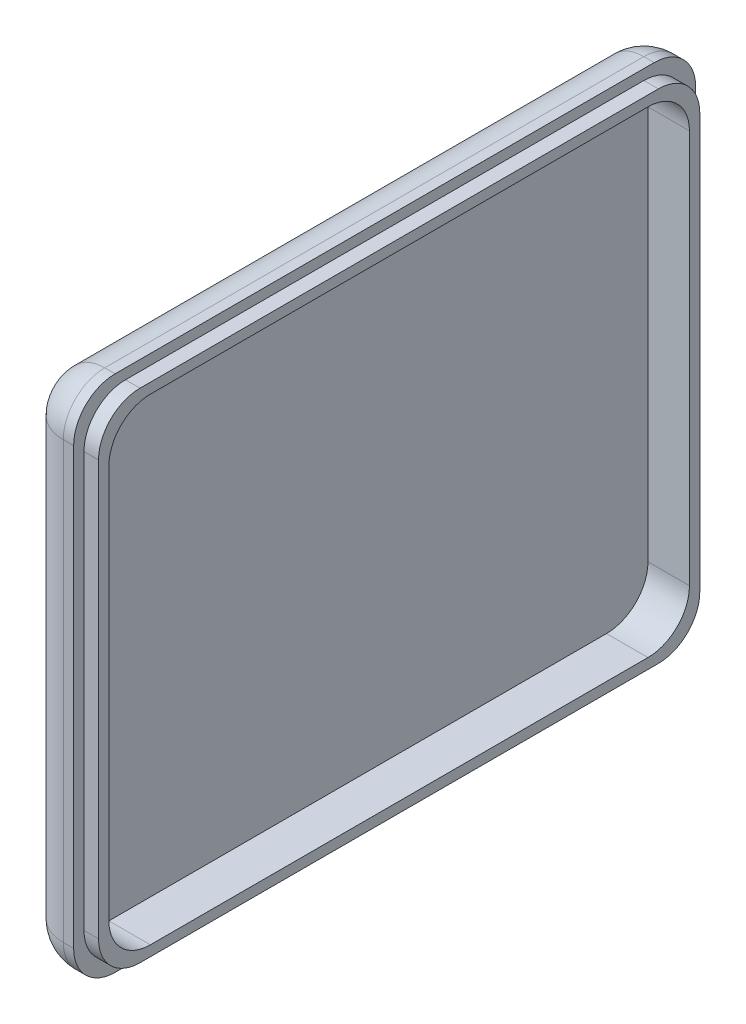
ISO-10303-21;
HEADER;
FILE_DESCRIPTION(('STEP AP214'),'2;1');
FILE_NAME('part.step','',(''),(''),'','','');
FILE_SCHEMA(('AUTOMOTIVE_DESIGN { 1 0 10303 214 1 1 1 1 }'));
ENDSEC;
DATA;
#1=APPLICATION_CONTEXT('core data for automotive mechanical design processes');
#2=APPLICATION_PROTOCOL_DEFINITION('international standard','automotive_design',2000,#1);
#3=PRODUCT_CONTEXT('',#1,'mechanical');
#4=PRODUCT('Part','Part','',(#3));
#5=PRODUCT_RELATED_PRODUCT_CATEGORY('part','',(#4));
#6=PRODUCT_DEFINITION_FORMATION('','',#4);
#7=PRODUCT_DEFINITION_CONTEXT('part definition',#1,'design');
#8=PRODUCT_DEFINITION('design','',#6,#7);
#9=PRODUCT_DEFINITION_SHAPE('','',#8);
#10=(LENGTH_UNIT() NAMED_UNIT(*) SI_UNIT(.MILLI.,.METRE.));
#11=(NAMED_UNIT(*) PLANE_ANGLE_UNIT() SI_UNIT($,.RADIAN.));
#12=(NAMED_UNIT(*) SI_UNIT($,.STERADIAN.) SOLID_ANGLE_UNIT());
#13=UNCERTAINTY_MEASURE_WITH_UNIT(LENGTH_MEASURE(1.E-05),#10,'distance_accuracy_value','');
#14=(GEOMETRIC_REPRESENTATION_CONTEXT(3) GLOBAL_UNCERTAINTY_ASSIGNED_CONTEXT((#13)) GLOBAL_UNIT_ASSIGNED_CONTEXT((#10,
#11,#12)) REPRESENTATION_CONTEXT('',''));
#15=CARTESIAN_POINT('',(0.,0.,0.));
#16=DIRECTION('',(0.,0.,1.));
#17=DIRECTION('',(1.,0.,0.));
#18=AXIS2_PLACEMENT_3D('',#15,#16,#17);
#19=CARTESIAN_POINT('',(6.35,63.5,-27.7706666666666));
#20=DIRECTION('',(0.,0.,-1.));
#21=DIRECTION('',(0.,1.,0.));
#22=AXIS2_PLACEMENT_3D('',#19,#20,#21);
#23=PLANE('',#22);
#24=DIRECTION('',(-1.,0.,0.));
#25=VECTOR('',#24,1.);
#26=CARTESIAN_POINT('',(6.35,58.42,-27.7706666666666));
#27=LINE('',#26,#25);
#28=CARTESIAN_POINT('',(6.35,58.42,-27.7706666666666));
#29=VERTEX_POINT('',#28);
#30=CARTESIAN_POINT('',(5.08,58.42,-27.7706666666666));
#31=VERTEX_POINT('',#30);
#32=EDGE_CURVE('E423',#29,#31,#27,.T.);
#33=ORIENTED_EDGE('',*,*,#32,.T.);
#34=DIRECTION('',(0.,-1.,0.));
#35=VECTOR('',#34,1.);
#36=CARTESIAN_POINT('',(5.08,63.5,-27.7706666666666));
#37=LINE('',#36,#35);
#38=CARTESIAN_POINT('',(5.08,5.08,-27.7706666666667));
#39=VERTEX_POINT('',#38);
#40=EDGE_CURVE('E11',#31,#39,#37,.T.);
#41=ORIENTED_EDGE('',*,*,#40,.T.);
#42=DIRECTION('',(-1.,0.,0.));
#43=VECTOR('',#42,1.);
#44=CARTESIAN_POINT('',(6.35,5.08,-27.7706666666667));
#45=LINE('',#44,#43);
#46=CARTESIAN_POINT('',(6.35,5.08,-27.7706666666667));
#47=VERTEX_POINT('',#46);
#48=EDGE_CURVE('E371',#39,#47,#45,.F.);
#49=ORIENTED_EDGE('',*,*,#48,.T.);
#50=DIRECTION('',(0.,-1.,0.));
#51=VECTOR('',#50,1.);
#52=CARTESIAN_POINT('',(6.35,63.5,-27.7706666666666));
#53=LINE('',#52,#51);
#54=EDGE_CURVE('E280',#29,#47,#53,.T.);
#55=ORIENTED_EDGE('',*,*,#54,.F.);
#56=EDGE_LOOP('',(#33,#41,#49,#55));
#57=FACE_BOUND('',#56,.T.);
#58=ADVANCED_FACE('F41',(#57),#23,.F.);
#59=CARTESIAN_POINT('',(6.35,0.,-27.7706666666667));
#60=DIRECTION('',(0.,1.,0.));
#61=DIRECTION('',(0.,0.,1.));
#62=AXIS2_PLACEMENT_3D('',#59,#60,#61);
#63=PLANE('',#62);
#64=DIRECTION('',(-1.,0.,0.));
#65=VECTOR('',#64,1.);
#66=CARTESIAN_POINT('',(6.35,0.,-32.8506666666667));
#67=LINE('',#66,#65);
#68=CARTESIAN_POINT('',(6.35,0.,-32.8506666666667));
#69=VERTEX_POINT('',#68);
#70=CARTESIAN_POINT('',(5.08,0.,-32.8506666666667));
#71=VERTEX_POINT('',#70);
#72=EDGE_CURVE('E367',#69,#71,#67,.T.);
#73=ORIENTED_EDGE('',*,*,#72,.T.);
#74=DIRECTION('',(0.,0.,-1.));
#75=VECTOR('',#74,1.);
#76=CARTESIAN_POINT('',(5.08,0.,-27.7706666666667));
#77=LINE('',#76,#75);
#78=CARTESIAN_POINT('',(5.08,0.,-98.8906666666667));
#79=VERTEX_POINT('',#78);
#80=EDGE_CURVE('E51',#71,#79,#77,.T.);
#81=ORIENTED_EDGE('',*,*,#80,.T.);
#82=DIRECTION('',(-1.,0.,0.));
#83=VECTOR('',#82,1.);
#84=CARTESIAN_POINT('',(6.35,0.,-98.8906666666667));
#85=LINE('',#84,#83);
#86=CARTESIAN_POINT('',(6.35,0.,-98.8906666666666));
#87=VERTEX_POINT('',#86);
#88=EDGE_CURVE('E405',#79,#87,#85,.F.);
#89=ORIENTED_EDGE('',*,*,#88,.T.);
#90=DIRECTION('',(0.,0.,-1.));
#91=VECTOR('',#90,1.);
#92=CARTESIAN_POINT('',(6.35,0.,-27.7706666666667));
#93=LINE('',#92,#91);
#94=EDGE_CURVE('E299',#69,#87,#93,.T.);
#95=ORIENTED_EDGE('',*,*,#94,.F.);
#96=EDGE_LOOP('',(#73,#81,#89,#95));
#97=FACE_BOUND('',#96,.T.);
#98=ADVANCED_FACE('F556',(#97),#63,.F.);
#99=CARTESIAN_POINT('',(6.35,63.5,-103.970666666667));
#100=DIRECTION('',(0.,0.,1.));
#101=DIRECTION('',(1.,0.,0.));
#102=AXIS2_PLACEMENT_3D('',#99,#100,#101);
#103=PLANE('',#102);
#104=DIRECTION('',(-1.,0.,0.));
#105=VECTOR('',#104,1.);
#106=CARTESIAN_POINT('',(6.35,5.08,-103.970666666667));
#107=LINE('',#106,#105);
#108=CARTESIAN_POINT('',(6.35,5.08,-103.970666666667));
#109=VERTEX_POINT('',#108);
#110=CARTESIAN_POINT('',(5.08,5.08,-103.970666666667));
#111=VERTEX_POINT('',#110);
#112=EDGE_CURVE('E381',#109,#111,#107,.T.);
#113=ORIENTED_EDGE('',*,*,#112,.T.);
#114=DIRECTION('',(0.,1.,0.));
#115=VECTOR('',#114,1.);
#116=CARTESIAN_POINT('',(5.08,63.5,-103.970666666667));
#117=LINE('',#116,#115);
#118=CARTESIAN_POINT('',(5.08,58.42,-103.970666666667));
#119=VERTEX_POINT('',#118);
#120=EDGE_CURVE('E473',#111,#119,#117,.T.);
#121=ORIENTED_EDGE('',*,*,#120,.T.);
#122=DIRECTION('',(-1.,0.,0.));
#123=VECTOR('',#122,1.);
#124=CARTESIAN_POINT('',(6.35,58.42,-103.970666666667));
#125=LINE('',#124,#123);
#126=CARTESIAN_POINT('',(6.35,58.42,-103.970666666667));
#127=VERTEX_POINT('',#126);
#128=EDGE_CURVE('E385',#119,#127,#125,.F.);
#129=ORIENTED_EDGE('',*,*,#128,.T.);
#130=DIRECTION('',(0.,1.,0.));
#131=VECTOR('',#130,1.);
#132=CARTESIAN_POINT('',(6.35,63.5,-103.970666666667));
#133=LINE('',#132,#131);
#134=EDGE_CURVE('E303',#109,#127,#133,.T.);
#135=ORIENTED_EDGE('',*,*,#134,.F.);
#136=EDGE_LOOP('',(#113,#121,#129,#135));
#137=FACE_BOUND('',#136,.T.);
#138=ADVANCED_FACE('F519',(#137),#103,.F.);
#139=CARTESIAN_POINT('',(6.35,63.5,-27.7706666666666));
#140=DIRECTION('',(0.,-1.,0.));
#141=DIRECTION('',(0.,0.,-1.));
#142=AXIS2_PLACEMENT_3D('',#139,#140,#141);
#143=PLANE('',#142);
#144=DIRECTION('',(-1.,0.,0.));
#145=VECTOR('',#144,1.);
#146=CARTESIAN_POINT('',(6.35,63.5,-98.8906666666667));
#147=LINE('',#146,#145);
#148=CARTESIAN_POINT('',(6.35,63.5,-98.8906666666667));
#149=VERTEX_POINT('',#148);
#150=CARTESIAN_POINT('',(5.08,63.5,-98.8906666666667));
#151=VERTEX_POINT('',#150);
#152=EDGE_CURVE('E377',#149,#151,#147,.T.);
#153=ORIENTED_EDGE('',*,*,#152,.T.);
#154=DIRECTION('',(0.,0.,1.));
#155=VECTOR('',#154,1.);
#156=CARTESIAN_POINT('',(5.08,63.5,-27.7706666666666));
#157=LINE('',#156,#155);
#158=CARTESIAN_POINT('',(5.08,63.5,-32.8506666666666));
#159=VERTEX_POINT('',#158);
#160=EDGE_CURVE('E459',#151,#159,#157,.T.);
#161=ORIENTED_EDGE('',*,*,#160,.T.);
#162=DIRECTION('',(-1.,0.,0.));
#163=VECTOR('',#162,1.);
#164=CARTESIAN_POINT('',(6.35,63.5,-32.8506666666666));
#165=LINE('',#164,#163);
#166=CARTESIAN_POINT('',(6.35,63.5,-32.8506666666666));
#167=VERTEX_POINT('',#166);
#168=EDGE_CURVE('E427',#159,#167,#165,.F.);
#169=ORIENTED_EDGE('',*,*,#168,.T.);
#170=DIRECTION('',(0.,0.,1.));
#171=VECTOR('',#170,1.);
#172=CARTESIAN_POINT('',(6.35,63.5,-27.7706666666666));
#173=LINE('',#172,#171);
#174=EDGE_CURVE('E307',#149,#167,#173,.T.);
#175=ORIENTED_EDGE('',*,*,#174,.F.);
#176=EDGE_LOOP('',(#153,#161,#169,#175));
#177=FACE_BOUND('',#176,.T.);
#178=ADVANCED_FACE('F531',(#177),#143,.F.);
#179=CARTESIAN_POINT('',(6.35,0.,0.));
#180=DIRECTION('',(1.,0.,0.));
#181=DIRECTION('',(0.,0.,-1.));
#182=AXIS2_PLACEMENT_3D('',#179,#180,#181);
#183=PLANE('',#182);
#184=DIRECTION('',(0.,-1.,0.));
#185=VECTOR('',#184,1.);
#186=CARTESIAN_POINT('',(6.35,62.23,-29.0406666666666));
#187=LINE('',#186,#185);
#188=CARTESIAN_POINT('',(6.35,57.15,-29.0406666666666));
#189=VERTEX_POINT('',#188);
#190=CARTESIAN_POINT('',(6.35,6.35,-29.0406666666667));
#191=VERTEX_POINT('',#190);
#192=EDGE_CURVE('E281',#189,#191,#187,.T.);
#193=ORIENTED_EDGE('',*,*,#192,.F.);
#194=CARTESIAN_POINT('',(6.35,57.15,-34.1206666666666));
#195=DIRECTION('',(1.,0.,0.));
#196=DIRECTION('',(0.,0.,-1.));
#197=AXIS2_PLACEMENT_3D('',#194,#195,#196);
#198=CIRCLE('',#197,5.08);
#199=CARTESIAN_POINT('',(6.35,62.23,-34.1206666666666));
#200=VERTEX_POINT('',#199);
#201=EDGE_CURVE('E440',#189,#200,#198,.F.);
#202=ORIENTED_EDGE('',*,*,#201,.T.);
#203=DIRECTION('',(0.,0.,1.));
#204=VECTOR('',#203,1.);
#205=CARTESIAN_POINT('',(6.35,62.23,-29.0406666666666));
#206=LINE('',#205,#204);
#207=CARTESIAN_POINT('',(6.35,62.23,-97.6206666666666));
#208=VERTEX_POINT('',#207);
#209=EDGE_CURVE('E268',#208,#200,#206,.T.);
#210=ORIENTED_EDGE('',*,*,#209,.F.);
#211=CARTESIAN_POINT('',(6.35,57.15,-97.6206666666667));
#212=DIRECTION('',(1.,0.,0.));
#213=DIRECTION('',(0.,0.,-1.));
#214=AXIS2_PLACEMENT_3D('',#211,#212,#213);
#215=CIRCLE('',#214,5.08);
#216=CARTESIAN_POINT('',(6.35,57.15,-102.700666666667));
#217=VERTEX_POINT('',#216);
#218=EDGE_CURVE('E411',#208,#217,#215,.F.);
#219=ORIENTED_EDGE('',*,*,#218,.T.);
#220=DIRECTION('',(0.,1.,0.));
#221=VECTOR('',#220,1.);
#222=CARTESIAN_POINT('',(6.35,62.23,-102.700666666667));
#223=LINE('',#222,#221);
#224=CARTESIAN_POINT('',(6.35,6.35,-102.700666666667));
#225=VERTEX_POINT('',#224);
#226=EDGE_CURVE('E289',#225,#217,#223,.T.);
#227=ORIENTED_EDGE('',*,*,#226,.F.);
#228=CARTESIAN_POINT('',(6.35,6.35,-97.6206666666667));
#229=DIRECTION('',(1.,0.,0.));
#230=DIRECTION('',(0.,0.,-1.));
#231=AXIS2_PLACEMENT_3D('',#228,#229,#230);
#232=CIRCLE('',#231,5.08);
#233=CARTESIAN_POINT('',(6.35,1.27,-97.6206666666667));
#234=VERTEX_POINT('',#233);
#235=EDGE_CURVE('E414',#225,#234,#232,.F.);
#236=ORIENTED_EDGE('',*,*,#235,.T.);
#237=DIRECTION('',(0.,0.,-1.));
#238=VECTOR('',#237,1.);
#239=CARTESIAN_POINT('',(6.35,1.27,-29.0406666666667));
#240=LINE('',#239,#238);
#241=CARTESIAN_POINT('',(6.35,1.27,-34.1206666666667));
#242=VERTEX_POINT('',#241);
#243=EDGE_CURVE('E284',#242,#234,#240,.T.);
#244=ORIENTED_EDGE('',*,*,#243,.F.);
#245=CARTESIAN_POINT('',(6.35,6.35,-34.1206666666667));
#246=DIRECTION('',(1.,0.,0.));
#247=DIRECTION('',(0.,0.,-1.));
#248=AXIS2_PLACEMENT_3D('',#245,#246,#247);
#249=CIRCLE('',#248,5.08);
#250=EDGE_CURVE('E363',#242,#191,#249,.F.);
#251=ORIENTED_EDGE('',*,*,#250,.T.);
#252=EDGE_LOOP('',(#193,#202,#210,#219,#227,#236,#244,#251));
#253=FACE_BOUND('',#252,.T.);
#254=ORIENTED_EDGE('',*,*,#174,.T.);
#255=CARTESIAN_POINT('',(6.35,58.42,-32.8506666666666));
#256=DIRECTION('',(1.,0.,0.));
#257=DIRECTION('',(0.,0.,-1.));
#258=AXIS2_PLACEMENT_3D('',#255,#256,#257);
#259=CIRCLE('',#258,5.08);
#260=EDGE_CURVE('E443',#167,#29,#259,.T.);
#261=ORIENTED_EDGE('',*,*,#260,.T.);
#262=ORIENTED_EDGE('',*,*,#54,.T.);
#263=CARTESIAN_POINT('',(6.35,5.08,-32.8506666666667));
#264=DIRECTION('',(1.,0.,0.));
#265=DIRECTION('',(0.,0.,-1.));
#266=AXIS2_PLACEMENT_3D('',#263,#264,#265);
#267=CIRCLE('',#266,5.08);
#268=EDGE_CURVE('E374',#47,#69,#267,.T.);
#269=ORIENTED_EDGE('',*,*,#268,.T.);
#270=ORIENTED_EDGE('',*,*,#94,.T.);
#271=CARTESIAN_POINT('',(6.35,5.08,-98.8906666666667));
#272=DIRECTION('',(1.,0.,0.));
#273=DIRECTION('',(0.,0.,-1.));
#274=AXIS2_PLACEMENT_3D('',#271,#272,#273);
#275=CIRCLE('',#274,5.08);
#276=EDGE_CURVE('E417',#87,#109,#275,.T.);
#277=ORIENTED_EDGE('',*,*,#276,.T.);
#278=ORIENTED_EDGE('',*,*,#134,.T.);
#279=CARTESIAN_POINT('',(6.35,58.42,-98.8906666666667));
#280=DIRECTION('',(1.,0.,0.));
#281=DIRECTION('',(0.,0.,-1.));
#282=AXIS2_PLACEMENT_3D('',#279,#280,#281);
#283=CIRCLE('',#282,5.08);
#284=EDGE_CURVE('E420',#127,#149,#283,.T.);
#285=ORIENTED_EDGE('',*,*,#284,.T.);
#286=EDGE_LOOP('',(#254,#261,#262,#269,#270,#277,#278,#285));
#287=FACE_BOUND('',#286,.T.);
#288=ADVANCED_FACE('F523',(#253,#287),#183,.T.);
#289=CARTESIAN_POINT('',(0.,0.,0.));
#290=DIRECTION('',(1.,0.,0.));
#291=DIRECTION('',(0.,0.,-1.));
#292=AXIS2_PLACEMENT_3D('',#289,#290,#291);
#293=PLANE('',#292);
#294=DIRECTION('',(0.,-1.,0.));
#295=VECTOR('',#294,1.);
#296=CARTESIAN_POINT('',(0.,0.,-32.8506666666667));
#297=LINE('',#296,#295);
#298=CARTESIAN_POINT('',(0.,5.08,-32.8506666666667));
#299=VERTEX_POINT('',#298);
#300=CARTESIAN_POINT('',(0.,58.42,-32.8506666666666));
#301=VERTEX_POINT('',#300);
#302=EDGE_CURVE('E462',#299,#301,#297,.F.);
#303=ORIENTED_EDGE('',*,*,#302,.T.);
#304=DIRECTION('',(0.,0.,1.));
#305=VECTOR('',#304,1.);
#306=CARTESIAN_POINT('',(0.,58.42,0.));
#307=LINE('',#306,#305);
#308=CARTESIAN_POINT('',(0.,58.42,-98.8906666666667));
#309=VERTEX_POINT('',#308);
#310=EDGE_CURVE('E470',#301,#309,#307,.F.);
#311=ORIENTED_EDGE('',*,*,#310,.T.);
#312=DIRECTION('',(0.,1.,0.));
#313=VECTOR('',#312,1.);
#314=CARTESIAN_POINT('',(0.,0.,-98.8906666666667));
#315=LINE('',#314,#313);
#316=CARTESIAN_POINT('',(0.,5.08,-98.8906666666667));
#317=VERTEX_POINT('',#316);
#318=EDGE_CURVE('E67',#309,#317,#315,.F.);
#319=ORIENTED_EDGE('',*,*,#318,.T.);
#320=DIRECTION('',(0.,0.,-1.));
#321=VECTOR('',#320,1.);
#322=CARTESIAN_POINT('',(0.,5.08,0.));
#323=LINE('',#322,#321);
#324=EDGE_CURVE('E465',#317,#299,#323,.F.);
#325=ORIENTED_EDGE('',*,*,#324,.T.);
#326=EDGE_LOOP('',(#303,#311,#319,#325));
#327=FACE_BOUND('',#326,.T.);
#328=ADVANCED_FACE('F753',(#327),#293,.F.);
#329=CARTESIAN_POINT('',(8.128,62.23,-29.0406666666666));
#330=DIRECTION('',(0.,0.,-1.));
#331=DIRECTION('',(0.,1.,0.));
#332=AXIS2_PLACEMENT_3D('',#329,#330,#331);
#333=PLANE('',#332);
#334=DIRECTION('',(0.,-1.,0.));
#335=VECTOR('',#334,1.);
#336=CARTESIAN_POINT('',(8.128,62.23,-29.0406666666666));
#337=LINE('',#336,#335);
#338=CARTESIAN_POINT('',(8.128,57.15,-29.0406666666666));
#339=VERTEX_POINT('',#338);
#340=CARTESIAN_POINT('',(8.128,6.35,-29.0406666666667));
#341=VERTEX_POINT('',#340);
#342=EDGE_CURVE('E264',#339,#341,#337,.T.);
#343=ORIENTED_EDGE('',*,*,#342,.F.);
#344=DIRECTION('',(-1.,0.,0.));
#345=VECTOR('',#344,1.);
#346=CARTESIAN_POINT('',(8.128,57.15,-29.0406666666666));
#347=LINE('',#346,#345);
#348=EDGE_CURVE('E430',#339,#189,#347,.T.);
#349=ORIENTED_EDGE('',*,*,#348,.T.);
#350=ORIENTED_EDGE('',*,*,#192,.T.);
#351=DIRECTION('',(-1.,0.,0.));
#352=VECTOR('',#351,1.);
#353=CARTESIAN_POINT('',(8.128,6.35,-29.0406666666667));
#354=LINE('',#353,#352);
#355=EDGE_CURVE('E356',#191,#341,#354,.F.);
#356=ORIENTED_EDGE('',*,*,#355,.T.);
#357=EDGE_LOOP('',(#343,#349,#350,#356));
#358=FACE_BOUND('',#357,.T.);
#359=ADVANCED_FACE('F746',(#358),#333,.F.);
#360=CARTESIAN_POINT('',(8.128,1.27,-29.0406666666667));
#361=DIRECTION('',(0.,1.,0.));
#362=DIRECTION('',(0.,0.,1.));
#363=AXIS2_PLACEMENT_3D('',#360,#361,#362);
#364=PLANE('',#363);
#365=ORIENTED_EDGE('',*,*,#243,.T.);
#366=DIRECTION('',(-1.,0.,0.));
#367=VECTOR('',#366,1.);
#368=CARTESIAN_POINT('',(8.128,1.27,-97.6206666666667));
#369=LINE('',#368,#367);
#370=CARTESIAN_POINT('',(8.128,1.27,-97.6206666666667));
#371=VERTEX_POINT('',#370);
#372=EDGE_CURVE('E408',#234,#371,#369,.F.);
#373=ORIENTED_EDGE('',*,*,#372,.T.);
#374=DIRECTION('',(0.,0.,-1.));
#375=VECTOR('',#374,1.);
#376=CARTESIAN_POINT('',(8.128,1.27,-29.0406666666667));
#377=LINE('',#376,#375);
#378=CARTESIAN_POINT('',(8.128,1.27,-34.1206666666667));
#379=VERTEX_POINT('',#378);
#380=EDGE_CURVE('E267',#379,#371,#377,.T.);
#381=ORIENTED_EDGE('',*,*,#380,.F.);
#382=DIRECTION('',(-1.,0.,0.));
#383=VECTOR('',#382,1.);
#384=CARTESIAN_POINT('',(8.128,1.27,-34.1206666666667));
#385=LINE('',#384,#383);
#386=EDGE_CURVE('E352',#379,#242,#385,.T.);
#387=ORIENTED_EDGE('',*,*,#386,.T.);
#388=EDGE_LOOP('',(#365,#373,#381,#387));
#389=FACE_BOUND('',#388,.T.);
#390=ADVANCED_FACE('F739',(#389),#364,.F.);
#391=CARTESIAN_POINT('',(8.128,62.23,-102.700666666667));
#392=DIRECTION('',(0.,0.,1.));
#393=DIRECTION('',(1.,0.,0.));
#394=AXIS2_PLACEMENT_3D('',#391,#392,#393);
#395=PLANE('',#394);
#396=ORIENTED_EDGE('',*,*,#226,.T.);
#397=DIRECTION('',(-1.,0.,0.));
#398=VECTOR('',#397,1.);
#399=CARTESIAN_POINT('',(8.128,57.15,-102.700666666667));
#400=LINE('',#399,#398);
#401=CARTESIAN_POINT('',(8.128,57.15,-102.700666666667));
#402=VERTEX_POINT('',#401);
#403=EDGE_CURVE('E396',#217,#402,#400,.F.);
#404=ORIENTED_EDGE('',*,*,#403,.T.);
#405=DIRECTION('',(0.,1.,0.));
#406=VECTOR('',#405,1.);
#407=CARTESIAN_POINT('',(8.128,62.23,-102.700666666667));
#408=LINE('',#407,#406);
#409=CARTESIAN_POINT('',(8.128,6.35,-102.700666666667));
#410=VERTEX_POINT('',#409);
#411=EDGE_CURVE('E272',#410,#402,#408,.T.);
#412=ORIENTED_EDGE('',*,*,#411,.F.);
#413=DIRECTION('',(-1.,0.,0.));
#414=VECTOR('',#413,1.);
#415=CARTESIAN_POINT('',(8.128,6.35,-102.700666666667));
#416=LINE('',#415,#414);
#417=EDGE_CURVE('E392',#410,#225,#416,.T.);
#418=ORIENTED_EDGE('',*,*,#417,.T.);
#419=EDGE_LOOP('',(#396,#404,#412,#418));
#420=FACE_BOUND('',#419,.T.);
#421=ADVANCED_FACE('F731',(#420),#395,.F.);
#422=CARTESIAN_POINT('',(8.128,62.23,-29.0406666666666));
#423=DIRECTION('',(0.,-1.,0.));
#424=DIRECTION('',(0.,0.,-1.));
#425=AXIS2_PLACEMENT_3D('',#422,#423,#424);
#426=PLANE('',#425);
#427=ORIENTED_EDGE('',*,*,#209,.T.);
#428=DIRECTION('',(-1.,0.,0.));
#429=VECTOR('',#428,1.);
#430=CARTESIAN_POINT('',(8.128,62.23,-34.1206666666666));
#431=LINE('',#430,#429);
#432=CARTESIAN_POINT('',(8.128,62.23,-34.1206666666666));
#433=VERTEX_POINT('',#432);
#434=EDGE_CURVE('E434',#200,#433,#431,.F.);
#435=ORIENTED_EDGE('',*,*,#434,.T.);
#436=DIRECTION('',(0.,0.,1.));
#437=VECTOR('',#436,1.);
#438=CARTESIAN_POINT('',(8.128,62.23,-29.0406666666666));
#439=LINE('',#438,#437);
#440=CARTESIAN_POINT('',(8.128,62.23,-97.6206666666666));
#441=VERTEX_POINT('',#440);
#442=EDGE_CURVE('E276',#441,#433,#439,.T.);
#443=ORIENTED_EDGE('',*,*,#442,.F.);
#444=DIRECTION('',(-1.,0.,0.));
#445=VECTOR('',#444,1.);
#446=CARTESIAN_POINT('',(8.128,62.23,-97.6206666666667));
#447=LINE('',#446,#445);
#448=EDGE_CURVE('E388',#441,#208,#447,.T.);
#449=ORIENTED_EDGE('',*,*,#448,.T.);
#450=EDGE_LOOP('',(#427,#435,#443,#449));
#451=FACE_BOUND('',#450,.T.);
#452=ADVANCED_FACE('F724',(#451),#426,.F.);
#453=CARTESIAN_POINT('',(8.128,0.,0.));
#454=DIRECTION('',(1.,0.,0.));
#455=DIRECTION('',(0.,0.,-1.));
#456=AXIS2_PLACEMENT_3D('',#453,#454,#455);
#457=PLANE('',#456);
#458=DIRECTION('',(0.,-1.,0.));
#459=VECTOR('',#458,1.);
#460=CARTESIAN_POINT('',(8.128,60.96,-30.3106666666666));
#461=LINE('',#460,#459);
#462=CARTESIAN_POINT('',(8.128,55.88,-30.3106666666666));
#463=VERTEX_POINT('',#462);
#464=CARTESIAN_POINT('',(8.128,7.62,-30.3106666666667));
#465=VERTEX_POINT('',#464);
#466=EDGE_CURVE('E250',#463,#465,#461,.T.);
#467=ORIENTED_EDGE('',*,*,#466,.F.);
#468=CARTESIAN_POINT('',(8.128,55.88,-35.3906666666666));
#469=DIRECTION('',(1.,0.,0.));
#470=DIRECTION('',(0.,0.,-1.));
#471=AXIS2_PLACEMENT_3D('',#468,#469,#470);
#472=CIRCLE('',#471,5.08);
#473=CARTESIAN_POINT('',(8.128,60.96,-35.3906666666666));
#474=VERTEX_POINT('',#473);
#475=EDGE_CURVE('E346',#463,#474,#472,.F.);
#476=ORIENTED_EDGE('',*,*,#475,.T.);
#477=DIRECTION('',(0.,0.,1.));
#478=VECTOR('',#477,1.);
#479=CARTESIAN_POINT('',(8.128,60.96,-30.3106666666666));
#480=LINE('',#479,#478);
#481=CARTESIAN_POINT('',(8.128,60.96,-96.3506666666667));
#482=VERTEX_POINT('',#481);
#483=EDGE_CURVE('E255',#482,#474,#480,.T.);
#484=ORIENTED_EDGE('',*,*,#483,.F.);
#485=CARTESIAN_POINT('',(8.128,55.88,-96.3506666666667));
#486=DIRECTION('',(1.,0.,0.));
#487=DIRECTION('',(0.,0.,-1.));
#488=AXIS2_PLACEMENT_3D('',#485,#486,#487);
#489=CIRCLE('',#488,5.08);
#490=CARTESIAN_POINT('',(8.128,55.88,-101.430666666667));
#491=VERTEX_POINT('',#490);
#492=EDGE_CURVE('E349',#482,#491,#489,.F.);
#493=ORIENTED_EDGE('',*,*,#492,.T.);
#494=DIRECTION('',(0.,1.,0.));
#495=VECTOR('',#494,1.);
#496=CARTESIAN_POINT('',(8.128,60.96,-101.430666666667));
#497=LINE('',#496,#495);
#498=CARTESIAN_POINT('',(8.128,7.62,-101.430666666667));
#499=VERTEX_POINT('',#498);
#500=EDGE_CURVE('E249',#499,#491,#497,.T.);
#501=ORIENTED_EDGE('',*,*,#500,.F.);
#502=CARTESIAN_POINT('',(8.128,7.62,-96.3506666666667));
#503=DIRECTION('',(1.,0.,0.));
#504=DIRECTION('',(0.,0.,-1.));
#505=AXIS2_PLACEMENT_3D('',#502,#503,#504);
#506=CIRCLE('',#505,5.08);
#507=CARTESIAN_POINT('',(8.128,2.54,-96.3506666666667));
#508=VERTEX_POINT('',#507);
#509=EDGE_CURVE('E231',#499,#508,#506,.F.);
#510=ORIENTED_EDGE('',*,*,#509,.T.);
#511=DIRECTION('',(0.,0.,-1.));
#512=VECTOR('',#511,1.);
#513=CARTESIAN_POINT('',(8.128,2.54,-30.3106666666667));
#514=LINE('',#513,#512);
#515=CARTESIAN_POINT('',(8.128,2.54,-35.3906666666667));
#516=VERTEX_POINT('',#515);
#517=EDGE_CURVE('E238',#516,#508,#514,.T.);
#518=ORIENTED_EDGE('',*,*,#517,.F.);
#519=CARTESIAN_POINT('',(8.128,7.62,-35.3906666666667));
#520=DIRECTION('',(1.,0.,0.));
#521=DIRECTION('',(0.,0.,-1.));
#522=AXIS2_PLACEMENT_3D('',#519,#520,#521);
#523=CIRCLE('',#522,5.08);
#524=EDGE_CURVE('E220',#516,#465,#523,.F.);
#525=ORIENTED_EDGE('',*,*,#524,.T.);
#526=EDGE_LOOP('',(#467,#476,#484,#493,#501,#510,#518,#525));
#527=FACE_BOUND('',#526,.T.);
#528=ORIENTED_EDGE('',*,*,#442,.T.);
#529=CARTESIAN_POINT('',(8.128,57.15,-34.1206666666666));
#530=DIRECTION('',(1.,0.,0.));
#531=DIRECTION('',(0.,0.,-1.));
#532=AXIS2_PLACEMENT_3D('',#529,#530,#531);
#533=CIRCLE('',#532,5.08);
#534=EDGE_CURVE('E437',#433,#339,#533,.T.);
#535=ORIENTED_EDGE('',*,*,#534,.T.);
#536=ORIENTED_EDGE('',*,*,#342,.T.);
#537=CARTESIAN_POINT('',(8.128,6.35,-34.1206666666667));
#538=DIRECTION('',(1.,0.,0.));
#539=DIRECTION('',(0.,0.,-1.));
#540=AXIS2_PLACEMENT_3D('',#537,#538,#539);
#541=CIRCLE('',#540,5.08);
#542=EDGE_CURVE('E360',#341,#379,#541,.T.);
#543=ORIENTED_EDGE('',*,*,#542,.T.);
#544=ORIENTED_EDGE('',*,*,#380,.T.);
#545=CARTESIAN_POINT('',(8.128,6.35,-97.6206666666667));
#546=DIRECTION('',(1.,0.,0.));
#547=DIRECTION('',(0.,0.,-1.));
#548=AXIS2_PLACEMENT_3D('',#545,#546,#547);
#549=CIRCLE('',#548,5.08);
#550=EDGE_CURVE('E399',#371,#410,#549,.T.);
#551=ORIENTED_EDGE('',*,*,#550,.T.);
#552=ORIENTED_EDGE('',*,*,#411,.T.);
#553=CARTESIAN_POINT('',(8.128,57.15,-97.6206666666667));
#554=DIRECTION('',(1.,0.,0.));
#555=DIRECTION('',(0.,0.,-1.));
#556=AXIS2_PLACEMENT_3D('',#553,#554,#555);
#557=CIRCLE('',#556,5.08);
#558=EDGE_CURVE('E402',#402,#441,#557,.T.);
#559=ORIENTED_EDGE('',*,*,#558,.T.);
#560=EDGE_LOOP('',(#528,#535,#536,#543,#544,#551,#552,#559));
#561=FACE_BOUND('',#560,.T.);
#562=ADVANCED_FACE('F245',(#527,#561),#457,.T.);
#563=CARTESIAN_POINT('',(3.048,60.96,-30.3106666666666));
#564=DIRECTION('',(0.,0.,1.));
#565=DIRECTION('',(0.,-1.,0.));
#566=AXIS2_PLACEMENT_3D('',#563,#564,#565);
#567=PLANE('',#566);
#568=DIRECTION('',(0.,-1.,0.));
#569=VECTOR('',#568,1.);
#570=CARTESIAN_POINT('',(3.048,60.96,-30.3106666666666));
#571=LINE('',#570,#569);
#572=CARTESIAN_POINT('',(3.048,55.88,-30.3106666666666));
#573=VERTEX_POINT('',#572);
#574=CARTESIAN_POINT('',(3.048,7.62,-30.3106666666667));
#575=VERTEX_POINT('',#574);
#576=EDGE_CURVE('E263',#573,#575,#571,.T.);
#577=ORIENTED_EDGE('',*,*,#576,.F.);
#578=DIRECTION('',(1.,0.,0.));
#579=VECTOR('',#578,1.);
#580=CARTESIAN_POINT('',(8.128,55.88,-30.3106666666666));
#581=LINE('',#580,#579);
#582=EDGE_CURVE('E326',#573,#463,#581,.T.);
#583=ORIENTED_EDGE('',*,*,#582,.T.);
#584=ORIENTED_EDGE('',*,*,#466,.T.);
#585=DIRECTION('',(1.,0.,0.));
#586=VECTOR('',#585,1.);
#587=CARTESIAN_POINT('',(3.048,7.62,-30.3106666666667));
#588=LINE('',#587,#586);
#589=EDGE_CURVE('E226',#465,#575,#588,.F.);
#590=ORIENTED_EDGE('',*,*,#589,.T.);
#591=EDGE_LOOP('',(#577,#583,#584,#590));
#592=FACE_BOUND('',#591,.T.);
#593=ADVANCED_FACE('F711',(#592),#567,.F.);
#594=CARTESIAN_POINT('',(3.048,60.96,-30.3106666666666));
#595=DIRECTION('',(0.,1.,0.));
#596=DIRECTION('',(0.,0.,1.));
#597=AXIS2_PLACEMENT_3D('',#594,#595,#596);
#598=PLANE('',#597);
#599=ORIENTED_EDGE('',*,*,#483,.T.);
#600=DIRECTION('',(1.,0.,0.));
#601=VECTOR('',#600,1.);
#602=CARTESIAN_POINT('',(3.048,60.96,-35.3906666666666));
#603=LINE('',#602,#601);
#604=CARTESIAN_POINT('',(3.048,60.96,-35.3906666666666));
#605=VERTEX_POINT('',#604);
#606=EDGE_CURVE('E334',#474,#605,#603,.F.);
#607=ORIENTED_EDGE('',*,*,#606,.T.);
#608=DIRECTION('',(0.,0.,1.));
#609=VECTOR('',#608,1.);
#610=CARTESIAN_POINT('',(3.048,60.96,-30.3106666666666));
#611=LINE('',#610,#609);
#612=CARTESIAN_POINT('',(3.048,60.96,-96.3506666666667));
#613=VERTEX_POINT('',#612);
#614=EDGE_CURVE('E285',#613,#605,#611,.T.);
#615=ORIENTED_EDGE('',*,*,#614,.F.);
#616=DIRECTION('',(1.,0.,0.));
#617=VECTOR('',#616,1.);
#618=CARTESIAN_POINT('',(8.128,60.96,-96.3506666666667));
#619=LINE('',#618,#617);
#620=EDGE_CURVE('E330',#613,#482,#619,.T.);
#621=ORIENTED_EDGE('',*,*,#620,.T.);
#622=EDGE_LOOP('',(#599,#607,#615,#621));
#623=FACE_BOUND('',#622,.T.);
#624=ADVANCED_FACE('F703',(#623),#598,.F.);
#625=CARTESIAN_POINT('',(3.048,60.96,-101.430666666667));
#626=DIRECTION('',(0.,0.,-1.));
#627=DIRECTION('',(0.,1.,0.));
#628=AXIS2_PLACEMENT_3D('',#625,#626,#627);
#629=PLANE('',#628);
#630=ORIENTED_EDGE('',*,*,#500,.T.);
#631=DIRECTION('',(1.,0.,0.));
#632=VECTOR('',#631,1.);
#633=CARTESIAN_POINT('',(3.048,55.88,-101.430666666667));
#634=LINE('',#633,#632);
#635=CARTESIAN_POINT('',(3.048,55.88,-101.430666666667));
#636=VERTEX_POINT('',#635);
#637=EDGE_CURVE('E343',#491,#636,#634,.F.);
#638=ORIENTED_EDGE('',*,*,#637,.T.);
#639=DIRECTION('',(0.,1.,0.));
#640=VECTOR('',#639,1.);
#641=CARTESIAN_POINT('',(3.048,60.96,-101.430666666667));
#642=LINE('',#641,#640);
#643=CARTESIAN_POINT('',(3.048,7.62,-101.430666666667));
#644=VERTEX_POINT('',#643);
#645=EDGE_CURVE('E925',#644,#636,#642,.T.);
#646=ORIENTED_EDGE('',*,*,#645,.F.);
#647=DIRECTION('',(1.,0.,0.));
#648=VECTOR('',#647,1.);
#649=CARTESIAN_POINT('',(8.128,7.62,-101.430666666667));
#650=LINE('',#649,#648);
#651=EDGE_CURVE('E232',#644,#499,#650,.T.);
#652=ORIENTED_EDGE('',*,*,#651,.T.);
#653=EDGE_LOOP('',(#630,#638,#646,#652));
#654=FACE_BOUND('',#653,.T.);
#655=ADVANCED_FACE('F697',(#654),#629,.F.);
#656=CARTESIAN_POINT('',(3.048,2.54,-30.3106666666667));
#657=DIRECTION('',(0.,-1.,0.));
#658=DIRECTION('',(0.,0.,-1.));
#659=AXIS2_PLACEMENT_3D('',#656,#657,#658);
#660=PLANE('',#659);
#661=DIRECTION('',(0.,0.,-1.));
#662=VECTOR('',#661,1.);
#663=CARTESIAN_POINT('',(3.048,2.54,-30.3106666666667));
#664=LINE('',#663,#662);
#665=CARTESIAN_POINT('',(3.048,2.54,-35.3906666666667));
#666=VERTEX_POINT('',#665);
#667=CARTESIAN_POINT('',(3.048,2.54,-96.3506666666667));
#668=VERTEX_POINT('',#667);
#669=EDGE_CURVE('E241',#666,#668,#664,.T.);
#670=ORIENTED_EDGE('',*,*,#669,.F.);
#671=DIRECTION('',(1.,0.,0.));
#672=VECTOR('',#671,1.);
#673=CARTESIAN_POINT('',(8.128,2.54,-35.3906666666667));
#674=LINE('',#673,#672);
#675=EDGE_CURVE('E224',#666,#516,#674,.T.);
#676=ORIENTED_EDGE('',*,*,#675,.T.);
#677=ORIENTED_EDGE('',*,*,#517,.T.);
#678=DIRECTION('',(1.,0.,0.));
#679=VECTOR('',#678,1.);
#680=CARTESIAN_POINT('',(3.048,2.54,-96.3506666666667));
#681=LINE('',#680,#679);
#682=EDGE_CURVE('E243',#508,#668,#681,.F.);
#683=ORIENTED_EDGE('',*,*,#682,.T.);
#684=EDGE_LOOP('',(#670,#676,#677,#683));
#685=FACE_BOUND('',#684,.T.);
#686=ADVANCED_FACE('F237',(#685),#660,.F.);
#687=CARTESIAN_POINT('',(3.048,0.,0.));
#688=DIRECTION('',(1.,0.,0.));
#689=DIRECTION('',(0.,0.,-1.));
#690=AXIS2_PLACEMENT_3D('',#687,#688,#689);
#691=PLANE('',#690);
#692=ORIENTED_EDGE('',*,*,#614,.T.);
#693=CARTESIAN_POINT('',(3.048,55.88,-35.3906666666666));
#694=DIRECTION('',(1.,0.,0.));
#695=DIRECTION('',(0.,0.,-1.));
#696=AXIS2_PLACEMENT_3D('',#693,#694,#695);
#697=CIRCLE('',#696,5.08);
#698=EDGE_CURVE('E340',#605,#573,#697,.T.);
#699=ORIENTED_EDGE('',*,*,#698,.T.);
#700=ORIENTED_EDGE('',*,*,#576,.T.);
#701=CARTESIAN_POINT('',(3.048,7.62,-35.3906666666667));
#702=DIRECTION('',(1.,0.,0.));
#703=DIRECTION('',(0.,0.,-1.));
#704=AXIS2_PLACEMENT_3D('',#701,#702,#703);
#705=CIRCLE('',#704,5.08);
#706=EDGE_CURVE('E318',#575,#666,#705,.T.);
#707=ORIENTED_EDGE('',*,*,#706,.T.);
#708=ORIENTED_EDGE('',*,*,#669,.T.);
#709=CARTESIAN_POINT('',(3.048,7.62,-96.3506666666667));
#710=DIRECTION('',(1.,0.,0.));
#711=DIRECTION('',(0.,0.,-1.));
#712=AXIS2_PLACEMENT_3D('',#709,#710,#711);
#713=CIRCLE('',#712,5.08);
#714=EDGE_CURVE('E315',#668,#644,#713,.T.);
#715=ORIENTED_EDGE('',*,*,#714,.T.);
#716=ORIENTED_EDGE('',*,*,#645,.T.);
#717=CARTESIAN_POINT('',(3.048,55.88,-96.3506666666667));
#718=DIRECTION('',(1.,0.,0.));
#719=DIRECTION('',(0.,0.,-1.));
#720=AXIS2_PLACEMENT_3D('',#717,#718,#719);
#721=CIRCLE('',#720,5.08);
#722=EDGE_CURVE('E337',#636,#613,#721,.T.);
#723=ORIENTED_EDGE('',*,*,#722,.T.);
#724=EDGE_LOOP('',(#692,#699,#700,#707,#708,#715,#716,#723));
#725=FACE_BOUND('',#724,.T.);
#726=ADVANCED_FACE('F570',(#725),#691,.T.);
#727=CARTESIAN_POINT('',(3.048,7.62,-35.3906666666667));
#728=DIRECTION('',(-1.,0.,0.));
#729=DIRECTION('',(0.,0.,1.));
#730=AXIS2_PLACEMENT_3D('',#727,#728,#729);
#731=CYLINDRICAL_SURFACE('',#730,5.08);
#732=ORIENTED_EDGE('',*,*,#706,.F.);
#733=ORIENTED_EDGE('',*,*,#589,.F.);
#734=ORIENTED_EDGE('',*,*,#524,.F.);
#735=ORIENTED_EDGE('',*,*,#675,.F.);
#736=EDGE_LOOP('',(#732,#733,#734,#735));
#737=FACE_BOUND('',#736,.T.);
#738=ADVANCED_FACE('F223',(#737),#731,.F.);
#739=CARTESIAN_POINT('',(3.048,7.62,-96.3506666666667));
#740=DIRECTION('',(-1.,0.,0.));
#741=DIRECTION('',(0.,0.,1.));
#742=AXIS2_PLACEMENT_3D('',#739,#740,#741);
#743=CYLINDRICAL_SURFACE('',#742,5.08);
#744=ORIENTED_EDGE('',*,*,#714,.F.);
#745=ORIENTED_EDGE('',*,*,#682,.F.);
#746=ORIENTED_EDGE('',*,*,#509,.F.);
#747=ORIENTED_EDGE('',*,*,#651,.F.);
#748=EDGE_LOOP('',(#744,#745,#746,#747));
#749=FACE_BOUND('',#748,.T.);
#750=ADVANCED_FACE('F569',(#749),#743,.F.);
#751=CARTESIAN_POINT('',(3.048,55.88,-35.3906666666666));
#752=DIRECTION('',(-1.,0.,0.));
#753=DIRECTION('',(0.,0.,1.));
#754=AXIS2_PLACEMENT_3D('',#751,#752,#753);
#755=CYLINDRICAL_SURFACE('',#754,5.08);
#756=ORIENTED_EDGE('',*,*,#698,.F.);
#757=ORIENTED_EDGE('',*,*,#606,.F.);
#758=ORIENTED_EDGE('',*,*,#475,.F.);
#759=ORIENTED_EDGE('',*,*,#582,.F.);
#760=EDGE_LOOP('',(#756,#757,#758,#759));
#761=FACE_BOUND('',#760,.T.);
#762=ADVANCED_FACE('F573',(#761),#755,.F.);
#763=CARTESIAN_POINT('',(3.048,55.88,-96.3506666666667));
#764=DIRECTION('',(-1.,0.,0.));
#765=DIRECTION('',(0.,0.,1.));
#766=AXIS2_PLACEMENT_3D('',#763,#764,#765);
#767=CYLINDRICAL_SURFACE('',#766,5.08);
#768=ORIENTED_EDGE('',*,*,#722,.F.);
#769=ORIENTED_EDGE('',*,*,#637,.F.);
#770=ORIENTED_EDGE('',*,*,#492,.F.);
#771=ORIENTED_EDGE('',*,*,#620,.F.);
#772=EDGE_LOOP('',(#768,#769,#770,#771));
#773=FACE_BOUND('',#772,.T.);
#774=ADVANCED_FACE('F577',(#773),#767,.F.);
#775=CARTESIAN_POINT('',(8.128,6.35,-34.1206666666667));
#776=DIRECTION('',(-1.,0.,0.));
#777=DIRECTION('',(0.,0.,1.));
#778=AXIS2_PLACEMENT_3D('',#775,#776,#777);
#779=CYLINDRICAL_SURFACE('',#778,5.08);
#780=ORIENTED_EDGE('',*,*,#542,.F.);
#781=ORIENTED_EDGE('',*,*,#355,.F.);
#782=ORIENTED_EDGE('',*,*,#250,.F.);
#783=ORIENTED_EDGE('',*,*,#386,.F.);
#784=EDGE_LOOP('',(#780,#781,#782,#783));
#785=FACE_BOUND('',#784,.T.);
#786=ADVANCED_FACE('F581',(#785),#779,.T.);
#787=CARTESIAN_POINT('',(6.35,5.08,-32.8506666666667));
#788=DIRECTION('',(-1.,0.,0.));
#789=DIRECTION('',(0.,0.,1.));
#790=AXIS2_PLACEMENT_3D('',#787,#788,#789);
#791=CYLINDRICAL_SURFACE('',#790,5.08);
#792=ORIENTED_EDGE('',*,*,#48,.F.);
#793=CARTESIAN_POINT('',(5.08,5.08,-32.8506666666667));
#794=DIRECTION('',(-1.,0.,0.));
#795=DIRECTION('',(0.,0.,1.));
#796=AXIS2_PLACEMENT_3D('',#793,#794,#795);
#797=CIRCLE('',#796,5.08);
#798=EDGE_CURVE('E456',#39,#71,#797,.F.);
#799=ORIENTED_EDGE('',*,*,#798,.T.);
#800=ORIENTED_EDGE('',*,*,#72,.F.);
#801=ORIENTED_EDGE('',*,*,#268,.F.);
#802=EDGE_LOOP('',(#792,#799,#800,#801));
#803=FACE_BOUND('',#802,.T.);
#804=ADVANCED_FACE('F553',(#803),#791,.T.);
#805=CARTESIAN_POINT('',(6.35,58.42,-98.8906666666667));
#806=DIRECTION('',(-1.,0.,0.));
#807=DIRECTION('',(0.,0.,1.));
#808=AXIS2_PLACEMENT_3D('',#805,#806,#807);
#809=CYLINDRICAL_SURFACE('',#808,5.08);
#810=ORIENTED_EDGE('',*,*,#128,.F.);
#811=CARTESIAN_POINT('',(5.08,58.42,-98.8906666666667));
#812=DIRECTION('',(-1.,0.,0.));
#813=DIRECTION('',(0.,0.,1.));
#814=AXIS2_PLACEMENT_3D('',#811,#812,#813);
#815=CIRCLE('',#814,5.08);
#816=EDGE_CURVE('E450',#119,#151,#815,.F.);
#817=ORIENTED_EDGE('',*,*,#816,.T.);
#818=ORIENTED_EDGE('',*,*,#152,.F.);
#819=ORIENTED_EDGE('',*,*,#284,.F.);
#820=EDGE_LOOP('',(#810,#817,#818,#819));
#821=FACE_BOUND('',#820,.T.);
#822=ADVANCED_FACE('F527',(#821),#809,.T.);
#823=CARTESIAN_POINT('',(8.128,57.15,-97.6206666666667));
#824=DIRECTION('',(-1.,0.,0.));
#825=DIRECTION('',(0.,0.,1.));
#826=AXIS2_PLACEMENT_3D('',#823,#824,#825);
#827=CYLINDRICAL_SURFACE('',#826,5.08);
#828=ORIENTED_EDGE('',*,*,#558,.F.);
#829=ORIENTED_EDGE('',*,*,#403,.F.);
#830=ORIENTED_EDGE('',*,*,#218,.F.);
#831=ORIENTED_EDGE('',*,*,#448,.F.);
#832=EDGE_LOOP('',(#828,#829,#830,#831));
#833=FACE_BOUND('',#832,.T.);
#834=ADVANCED_FACE('F590',(#833),#827,.T.);
#835=CARTESIAN_POINT('',(6.35,5.08,-98.8906666666667));
#836=DIRECTION('',(-1.,0.,0.));
#837=DIRECTION('',(0.,0.,1.));
#838=AXIS2_PLACEMENT_3D('',#835,#836,#837);
#839=CYLINDRICAL_SURFACE('',#838,5.08);
#840=ORIENTED_EDGE('',*,*,#88,.F.);
#841=CARTESIAN_POINT('',(5.08,5.08,-98.8906666666667));
#842=DIRECTION('',(-1.,0.,0.));
#843=DIRECTION('',(0.,0.,1.));
#844=AXIS2_PLACEMENT_3D('',#841,#842,#843);
#845=CIRCLE('',#844,5.08);
#846=EDGE_CURVE('E453',#79,#111,#845,.F.);
#847=ORIENTED_EDGE('',*,*,#846,.T.);
#848=ORIENTED_EDGE('',*,*,#112,.F.);
#849=ORIENTED_EDGE('',*,*,#276,.F.);
#850=EDGE_LOOP('',(#840,#847,#848,#849));
#851=FACE_BOUND('',#850,.T.);
#852=ADVANCED_FACE('F515',(#851),#839,.T.);
#853=CARTESIAN_POINT('',(8.128,6.35,-97.6206666666667));
#854=DIRECTION('',(-1.,0.,0.));
#855=DIRECTION('',(0.,0.,1.));
#856=AXIS2_PLACEMENT_3D('',#853,#854,#855);
#857=CYLINDRICAL_SURFACE('',#856,5.08);
#858=ORIENTED_EDGE('',*,*,#550,.F.);
#859=ORIENTED_EDGE('',*,*,#372,.F.);
#860=ORIENTED_EDGE('',*,*,#235,.F.);
#861=ORIENTED_EDGE('',*,*,#417,.F.);
#862=EDGE_LOOP('',(#858,#859,#860,#861));
#863=FACE_BOUND('',#862,.T.);
#864=ADVANCED_FACE('F596',(#863),#857,.T.);
#865=CARTESIAN_POINT('',(6.35,58.42,-32.8506666666666));
#866=DIRECTION('',(-1.,0.,0.));
#867=DIRECTION('',(0.,0.,1.));
#868=AXIS2_PLACEMENT_3D('',#865,#866,#867);
#869=CYLINDRICAL_SURFACE('',#868,5.08);
#870=ORIENTED_EDGE('',*,*,#168,.F.);
#871=CARTESIAN_POINT('',(5.08,58.42,-32.8506666666666));
#872=DIRECTION('',(-1.,0.,0.));
#873=DIRECTION('',(0.,0.,1.));
#874=AXIS2_PLACEMENT_3D('',#871,#872,#873);
#875=CIRCLE('',#874,5.08);
#876=EDGE_CURVE('E446',#159,#31,#875,.F.);
#877=ORIENTED_EDGE('',*,*,#876,.T.);
#878=ORIENTED_EDGE('',*,*,#32,.F.);
#879=ORIENTED_EDGE('',*,*,#260,.F.);
#880=EDGE_LOOP('',(#870,#877,#878,#879));
#881=FACE_BOUND('',#880,.T.);
#882=ADVANCED_FACE('F544',(#881),#869,.T.);
#883=CARTESIAN_POINT('',(8.128,57.15,-34.1206666666666));
#884=DIRECTION('',(-1.,0.,0.));
#885=DIRECTION('',(0.,0.,1.));
#886=AXIS2_PLACEMENT_3D('',#883,#884,#885);
#887=CYLINDRICAL_SURFACE('',#886,5.08);
#888=ORIENTED_EDGE('',*,*,#534,.F.);
#889=ORIENTED_EDGE('',*,*,#434,.F.);
#890=ORIENTED_EDGE('',*,*,#201,.F.);
#891=ORIENTED_EDGE('',*,*,#348,.F.);
#892=EDGE_LOOP('',(#888,#889,#890,#891));
#893=FACE_BOUND('',#892,.T.);
#894=ADVANCED_FACE('F602',(#893),#887,.T.);
#895=CARTESIAN_POINT('',(5.08,5.08,-98.8906666666667));
#896=DIRECTION('',(1.,0.,0.));
#897=DIRECTION('',(0.,0.,-1.));
#898=AXIS2_PLACEMENT_3D('',#895,#896,#897);
#899=SPHERICAL_SURFACE('',#898,5.08);
#900=CARTESIAN_POINT('',(5.08,5.08,-98.8906666666667));
#901=DIRECTION('',(0.,1.,0.));
#902=DIRECTION('',(0.,0.,1.));
#903=AXIS2_PLACEMENT_3D('',#900,#901,#902);
#904=CIRCLE('',#903,5.08);
#905=EDGE_CURVE('E497',#111,#317,#904,.T.);
#906=ORIENTED_EDGE('',*,*,#905,.F.);
#907=ORIENTED_EDGE('',*,*,#846,.F.);
#908=CARTESIAN_POINT('',(5.08,5.08,-98.8906666666667));
#909=DIRECTION('',(0.,0.,1.));
#910=DIRECTION('',(1.,0.,0.));
#911=AXIS2_PLACEMENT_3D('',#908,#909,#910);
#912=CIRCLE('',#911,5.08);
#913=EDGE_CURVE('E45',#317,#79,#912,.T.);
#914=ORIENTED_EDGE('',*,*,#913,.F.);
#915=EDGE_LOOP('',(#906,#907,#914));
#916=FACE_BOUND('',#915,.T.);
#917=ADVANCED_FACE('F43',(#916),#899,.T.);
#918=CARTESIAN_POINT('',(5.08,5.08,-27.7706666666667));
#919=DIRECTION('',(0.,0.,-1.));
#920=DIRECTION('',(-1.,0.,0.));
#921=AXIS2_PLACEMENT_3D('',#918,#919,#920);
#922=CYLINDRICAL_SURFACE('',#921,5.08);
#923=ORIENTED_EDGE('',*,*,#913,.T.);
#924=ORIENTED_EDGE('',*,*,#80,.F.);
#925=CARTESIAN_POINT('',(5.08,5.08,-32.8506666666667));
#926=DIRECTION('',(0.,0.,1.));
#927=DIRECTION('',(1.,0.,0.));
#928=AXIS2_PLACEMENT_3D('',#925,#926,#927);
#929=CIRCLE('',#928,5.08);
#930=EDGE_CURVE('E494',#299,#71,#929,.T.);
#931=ORIENTED_EDGE('',*,*,#930,.F.);
#932=ORIENTED_EDGE('',*,*,#324,.F.);
#933=EDGE_LOOP('',(#923,#924,#931,#932));
#934=FACE_BOUND('',#933,.T.);
#935=ADVANCED_FACE('F508',(#934),#922,.T.);
#936=CARTESIAN_POINT('',(5.08,63.5,-98.8906666666667));
#937=DIRECTION('',(0.,1.,0.));
#938=DIRECTION('',(0.,0.,1.));
#939=AXIS2_PLACEMENT_3D('',#936,#937,#938);
#940=CYLINDRICAL_SURFACE('',#939,5.08);
#941=ORIENTED_EDGE('',*,*,#905,.T.);
#942=ORIENTED_EDGE('',*,*,#318,.F.);
#943=CARTESIAN_POINT('',(5.08,58.42,-98.8906666666667));
#944=DIRECTION('',(0.,1.,0.));
#945=DIRECTION('',(0.,0.,1.));
#946=AXIS2_PLACEMENT_3D('',#943,#944,#945);
#947=CIRCLE('',#946,5.08);
#948=EDGE_CURVE('E491',#119,#309,#947,.T.);
#949=ORIENTED_EDGE('',*,*,#948,.F.);
#950=ORIENTED_EDGE('',*,*,#120,.F.);
#951=EDGE_LOOP('',(#941,#942,#949,#950));
#952=FACE_BOUND('',#951,.T.);
#953=ADVANCED_FACE('F619',(#952),#940,.T.);
#954=CARTESIAN_POINT('',(5.08,5.08,-32.8506666666667));
#955=DIRECTION('',(1.,0.,0.));
#956=DIRECTION('',(0.,0.,-1.));
#957=AXIS2_PLACEMENT_3D('',#954,#955,#956);
#958=SPHERICAL_SURFACE('',#957,5.08);
#959=ORIENTED_EDGE('',*,*,#930,.T.);
#960=ORIENTED_EDGE('',*,*,#798,.F.);
#961=CARTESIAN_POINT('',(5.08,5.08,-32.8506666666667));
#962=DIRECTION('',(0.,1.,0.));
#963=DIRECTION('',(0.,0.,1.));
#964=AXIS2_PLACEMENT_3D('',#961,#962,#963);
#965=CIRCLE('',#964,5.08);
#966=EDGE_CURVE('E487',#299,#39,#965,.T.);
#967=ORIENTED_EDGE('',*,*,#966,.F.);
#968=EDGE_LOOP('',(#959,#960,#967));
#969=FACE_BOUND('',#968,.T.);
#970=ADVANCED_FACE('F616',(#969),#958,.T.);
#971=CARTESIAN_POINT('',(5.08,58.42,-98.8906666666667));
#972=DIRECTION('',(1.,0.,0.));
#973=DIRECTION('',(0.,0.,-1.));
#974=AXIS2_PLACEMENT_3D('',#971,#972,#973);
#975=SPHERICAL_SURFACE('',#974,5.08);
#976=ORIENTED_EDGE('',*,*,#816,.F.);
#977=ORIENTED_EDGE('',*,*,#948,.T.);
#978=CARTESIAN_POINT('',(5.08,58.42,-98.8906666666667));
#979=DIRECTION('',(0.,0.,1.));
#980=DIRECTION('',(1.,0.,0.));
#981=AXIS2_PLACEMENT_3D('',#978,#979,#980);
#982=CIRCLE('',#981,5.08);
#983=EDGE_CURVE('E59',#151,#309,#982,.T.);
#984=ORIENTED_EDGE('',*,*,#983,.F.);
#985=EDGE_LOOP('',(#976,#977,#984));
#986=FACE_BOUND('',#985,.T.);
#987=ADVANCED_FACE('F534',(#986),#975,.T.);
#988=CARTESIAN_POINT('',(5.08,63.5,-32.8506666666666));
#989=DIRECTION('',(0.,-1.,0.));
#990=DIRECTION('',(0.,0.,-1.));
#991=AXIS2_PLACEMENT_3D('',#988,#989,#990);
#992=CYLINDRICAL_SURFACE('',#991,5.08);
#993=ORIENTED_EDGE('',*,*,#966,.T.);
#994=ORIENTED_EDGE('',*,*,#40,.F.);
#995=CARTESIAN_POINT('',(5.08,58.42,-32.8506666666666));
#996=DIRECTION('',(0.,1.,0.));
#997=DIRECTION('',(0.,0.,1.));
#998=AXIS2_PLACEMENT_3D('',#995,#996,#997);
#999=CIRCLE('',#998,5.08);
#1000=EDGE_CURVE('E482',#301,#31,#999,.T.);
#1001=ORIENTED_EDGE('',*,*,#1000,.F.);
#1002=ORIENTED_EDGE('',*,*,#302,.F.);
#1003=EDGE_LOOP('',(#993,#994,#1001,#1002));
#1004=FACE_BOUND('',#1003,.T.);
#1005=ADVANCED_FACE('F610',(#1004),#992,.T.);
#1006=CARTESIAN_POINT('',(5.08,58.42,-27.7706666666666));
#1007=DIRECTION('',(0.,0.,1.));
#1008=DIRECTION('',(1.,0.,0.));
#1009=AXIS2_PLACEMENT_3D('',#1006,#1007,#1008);
#1010=CYLINDRICAL_SURFACE('',#1009,5.08);
#1011=ORIENTED_EDGE('',*,*,#983,.T.);
#1012=ORIENTED_EDGE('',*,*,#310,.F.);
#1013=CARTESIAN_POINT('',(5.08,58.42,-32.8506666666666));
#1014=DIRECTION('',(0.,0.,1.));
#1015=DIRECTION('',(1.,0.,0.));
#1016=AXIS2_PLACEMENT_3D('',#1013,#1014,#1015);
#1017=CIRCLE('',#1016,5.08);
#1018=EDGE_CURVE('E478',#159,#301,#1017,.T.);
#1019=ORIENTED_EDGE('',*,*,#1018,.F.);
#1020=ORIENTED_EDGE('',*,*,#160,.F.);
#1021=EDGE_LOOP('',(#1011,#1012,#1019,#1020));
#1022=FACE_BOUND('',#1021,.T.);
#1023=ADVANCED_FACE('F536',(#1022),#1010,.T.);
#1024=CARTESIAN_POINT('',(5.08,58.42,-32.8506666666666));
#1025=DIRECTION('',(1.,0.,0.));
#1026=DIRECTION('',(0.,0.,-1.));
#1027=AXIS2_PLACEMENT_3D('',#1024,#1025,#1026);
#1028=SPHERICAL_SURFACE('',#1027,5.08);
#1029=ORIENTED_EDGE('',*,*,#1000,.T.);
#1030=ORIENTED_EDGE('',*,*,#876,.F.);
#1031=ORIENTED_EDGE('',*,*,#1018,.T.);
#1032=EDGE_LOOP('',(#1029,#1030,#1031));
#1033=FACE_BOUND('',#1032,.T.);
#1034=ADVANCED_FACE('F540',(#1033),#1028,.T.);
#1035=CLOSED_SHELL('',(#58,#98,#138,#178,#288,#328,#359,#390,#421,#452,#562,#593,#624,#655,#686,
#726,#738,#750,#762,#774,#786,#804,#822,#834,#852,#864,#882,#894,#917,#935,#953,#970,#987,#1005,
#1023,#1034));
#1036=MANIFOLD_SOLID_BREP('B2',#1035);
#1037=ADVANCED_BREP_SHAPE_REPRESENTATION('',(#18,#1036),#14);
#1038=SHAPE_DEFINITION_REPRESENTATION(#9,#1037);
ENDSEC;
END-ISO-10303-21;
